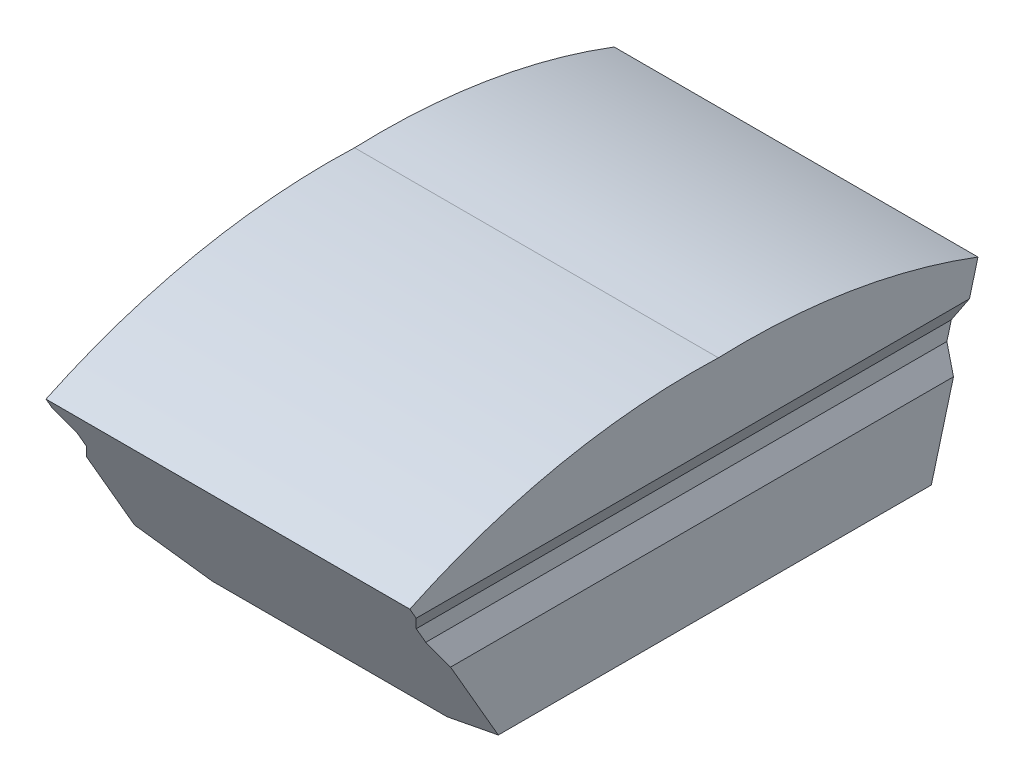
ISO-10303-21;
HEADER;
FILE_DESCRIPTION(('STEP AP214'),'2;1');
FILE_NAME('part.step','',(''),(''),'','','');
FILE_SCHEMA(('AUTOMOTIVE_DESIGN { 1 0 10303 214 1 1 1 1 }'));
ENDSEC;
DATA;
#1=APPLICATION_CONTEXT('core data for automotive mechanical design processes');
#2=APPLICATION_PROTOCOL_DEFINITION('international standard','automotive_design',2000,#1);
#3=PRODUCT_CONTEXT('',#1,'mechanical');
#4=PRODUCT('Part','Part','',(#3));
#5=PRODUCT_RELATED_PRODUCT_CATEGORY('part','',(#4));
#6=PRODUCT_DEFINITION_FORMATION('','',#4);
#7=PRODUCT_DEFINITION_CONTEXT('part definition',#1,'design');
#8=PRODUCT_DEFINITION('design','',#6,#7);
#9=PRODUCT_DEFINITION_SHAPE('','',#8);
#10=(LENGTH_UNIT() NAMED_UNIT(*) SI_UNIT(.MILLI.,.METRE.));
#11=(NAMED_UNIT(*) PLANE_ANGLE_UNIT() SI_UNIT($,.RADIAN.));
#12=(NAMED_UNIT(*) SI_UNIT($,.STERADIAN.) SOLID_ANGLE_UNIT());
#13=UNCERTAINTY_MEASURE_WITH_UNIT(LENGTH_MEASURE(1.E-05),#10,'distance_accuracy_value','');
#14=(GEOMETRIC_REPRESENTATION_CONTEXT(3) GLOBAL_UNCERTAINTY_ASSIGNED_CONTEXT((#13)) GLOBAL_UNIT_ASSIGNED_CONTEXT((#10,
#11,#12)) REPRESENTATION_CONTEXT('',''));
#15=CARTESIAN_POINT('',(0.,0.,0.));
#16=DIRECTION('',(0.,0.,1.));
#17=DIRECTION('',(1.,0.,0.));
#18=AXIS2_PLACEMENT_3D('',#15,#16,#17);
#19=CARTESIAN_POINT('',(0.,-31.2500000000001,-116.626587736527));
#20=DIRECTION('',(0.,0.258819045102521,0.965925826289068));
#21=DIRECTION('',(0.,-0.965925826289068,0.258819045102521));
#22=AXIS2_PLACEMENT_3D('',#19,#20,#21);
#23=PLANE('',#22);
#24=DIRECTION('',(0.937361302155128,0.336488672568508,-0.0901618680769524));
#25=VECTOR('',#24,1.);
#26=CARTESIAN_POINT('',(82.215832693011,4.0261963513373,-126.07881606091));
#27=LINE('',#26,#25);
#28=CARTESIAN_POINT('',(71.,0.,-125.));
#29=VERTEX_POINT('',#28);
#30=CARTESIAN_POINT('',(110.,14.,-128.751288694036));
#31=VERTEX_POINT('',#30);
#32=EDGE_CURVE('E197',#29,#31,#27,.T.);
#33=ORIENTED_EDGE('',*,*,#32,.F.);
#34=DIRECTION('',(1.,0.,0.));
#35=VECTOR('',#34,1.);
#36=CARTESIAN_POINT('',(71.,0.,-125.));
#37=LINE('',#36,#35);
#38=CARTESIAN_POINT('',(-71.,0.,-125.));
#39=VERTEX_POINT('',#38);
#40=EDGE_CURVE('E194',#39,#29,#37,.T.);
#41=ORIENTED_EDGE('',*,*,#40,.F.);
#42=DIRECTION('',(0.937361302155128,-0.336488672568508,0.0901618680769524));
#43=VECTOR('',#42,1.);
#44=CARTESIAN_POINT('',(-116.021531119151,16.1615752735415,-129.33048104296));
#45=LINE('',#44,#43);
#46=CARTESIAN_POINT('',(-110.,14.,-128.751288694036));
#47=VERTEX_POINT('',#46);
#48=EDGE_CURVE('E192',#47,#39,#45,.T.);
#49=ORIENTED_EDGE('',*,*,#48,.F.);
#50=DIRECTION('',(0.,-0.965925826289068,0.258819045102521));
#51=VECTOR('',#50,1.);
#52=CARTESIAN_POINT('',(-110.,31.8121778264911,-133.524047358084));
#53=LINE('',#52,#51);
#54=CARTESIAN_POINT('',(-110.,64.,-142.148748315592));
#55=VERTEX_POINT('',#54);
#56=EDGE_CURVE('E190',#55,#47,#53,.T.);
#57=ORIENTED_EDGE('',*,*,#56,.F.);
#58=DIRECTION('',(-0.485956523762208,-0.844202736364856,0.226203441457108));
#59=VECTOR('',#58,1.);
#60=CARTESIAN_POINT('',(-103.640698955989,75.0473655156623,-145.108880984005));
#61=LINE('',#60,#59);
#62=CARTESIAN_POINT('',(-102.516685226452,77.,-145.632087817196));
#63=VERTEX_POINT('',#62);
#64=EDGE_CURVE('E188',#63,#55,#61,.T.);
#65=ORIENTED_EDGE('',*,*,#64,.F.);
#66=DIRECTION('',(0.,-0.965925826289068,0.258819045102521));
#67=VECTOR('',#66,1.);
#68=CARTESIAN_POINT('',(-102.516685226452,90.5919780457009,-149.274047358084));
#69=LINE('',#68,#67);
#70=CARTESIAN_POINT('',(-102.516685226452,87.,-148.311579741508));
#71=VERTEX_POINT('',#70);
#72=EDGE_CURVE('E185',#71,#63,#69,.T.);
#73=ORIENTED_EDGE('',*,*,#72,.F.);
#74=DIRECTION('',(0.485956523762209,-0.844202736364856,0.226203441457108));
#75=VECTOR('',#74,1.);
#76=CARTESIAN_POINT('',(-115.298945337539,109.205317626289,-154.261476667148));
#77=LINE('',#76,#75);
#78=CARTESIAN_POINT('',(-110.,100.,-151.794919243112));
#79=VERTEX_POINT('',#78);
#80=EDGE_CURVE('E57',#79,#71,#77,.T.);
#81=ORIENTED_EDGE('',*,*,#80,.F.);
#82=DIRECTION('',(0.,-0.965925826289068,0.258819045102521));
#83=VECTOR('',#82,1.);
#84=CARTESIAN_POINT('',(-110.,158.701905283833,-167.524047358084));
#85=LINE('',#84,#83);
#86=CARTESIAN_POINT('',(-110.,119.294166686901,-156.964775625499));
#87=VERTEX_POINT('',#86);
#88=EDGE_CURVE('E198',#87,#79,#85,.T.);
#89=ORIENTED_EDGE('',*,*,#88,.F.);
#90=DIRECTION('',(-1.,0.,0.));
#91=VECTOR('',#90,1.);
#92=CARTESIAN_POINT('',(110.,119.294166686901,-156.964775625499));
#93=LINE('',#92,#91);
#94=CARTESIAN_POINT('',(110.,119.294166686901,-156.964775625499));
#95=VERTEX_POINT('',#94);
#96=EDGE_CURVE('E167',#95,#87,#93,.T.);
#97=ORIENTED_EDGE('',*,*,#96,.F.);
#98=DIRECTION('',(0.,0.965925826289068,-0.258819045102521));
#99=VECTOR('',#98,1.);
#100=CARTESIAN_POINT('',(110.,58.7019052838327,-140.729128114971));
#101=LINE('',#100,#99);
#102=CARTESIAN_POINT('',(110.,100.,-151.794919243112));
#103=VERTEX_POINT('',#102);
#104=EDGE_CURVE('E196',#103,#95,#101,.T.);
#105=ORIENTED_EDGE('',*,*,#104,.F.);
#106=DIRECTION('',(0.485956523762209,0.844202736364856,-0.226203441457108));
#107=VECTOR('',#106,1.);
#108=CARTESIAN_POINT('',(71.3289301081214,32.8206919249938,-133.794277896333));
#109=LINE('',#108,#107);
#110=CARTESIAN_POINT('',(102.516685226452,87.,-148.311579741508));
#111=VERTEX_POINT('',#110);
#112=EDGE_CURVE('E206',#111,#103,#109,.T.);
#113=ORIENTED_EDGE('',*,*,#112,.F.);
#114=DIRECTION('',(0.,0.965925826289068,-0.258819045102521));
#115=VECTOR('',#114,1.);
#116=CARTESIAN_POINT('',(102.516685226452,-9.40802195429931,-122.479128114971));
#117=LINE('',#116,#115);
#118=CARTESIAN_POINT('',(102.516685226452,77.,-145.632087817196));
#119=VERTEX_POINT('',#118);
#120=EDGE_CURVE('E208',#119,#111,#117,.T.);
#121=ORIENTED_EDGE('',*,*,#120,.F.);
#122=DIRECTION('',(-0.485956523762208,0.844202736364856,-0.226203441457108));
#123=VECTOR('',#122,1.);
#124=CARTESIAN_POINT('',(147.610714185407,-1.33726018563284,-124.641682213189));
#125=LINE('',#124,#123);
#126=CARTESIAN_POINT('',(110.,64.,-142.148748315592));
#127=VERTEX_POINT('',#126);
#128=EDGE_CURVE('E210',#127,#119,#125,.T.);
#129=ORIENTED_EDGE('',*,*,#128,.F.);
#130=DIRECTION('',(0.,0.965925826289068,-0.258819045102521));
#131=VECTOR('',#130,1.);
#132=CARTESIAN_POINT('',(110.,-68.1878221735091,-106.729128114971));
#133=LINE('',#132,#131);
#134=EDGE_CURVE('E204',#31,#127,#133,.T.);
#135=ORIENTED_EDGE('',*,*,#134,.F.);
#136=EDGE_LOOP('',(#33,#41,#49,#57,#65,#73,#81,#89,#97,#105,#113,#121,#129,#135));
#137=FACE_BOUND('',#136,.T.);
#138=ADVANCED_FACE('F41',(#137),#23,.F.);
#139=CARTESIAN_POINT('',(0.,-54.1265877365275,93.7499999999999));
#140=DIRECTION('',(0.,-0.500000000000001,0.866025403784438));
#141=DIRECTION('',(0.,-0.866025403784438,-0.500000000000001));
#142=AXIS2_PLACEMENT_3D('',#139,#140,#141);
#143=PLANE('',#142);
#144=DIRECTION('',(0.923783375421663,0.331614545023161,0.191457746836318));
#145=VECTOR('',#144,1.);
#146=CARTESIAN_POINT('',(121.835324587609,18.2485780570904,135.535821453589));
#147=LINE('',#146,#145);
#148=CARTESIAN_POINT('',(71.,0.,125.));
#149=VERTEX_POINT('',#148);
#150=CARTESIAN_POINT('',(110.,14.,133.082903768655));
#151=VERTEX_POINT('',#150);
#152=EDGE_CURVE('E228',#149,#151,#147,.T.);
#153=ORIENTED_EDGE('',*,*,#152,.T.);
#154=DIRECTION('',(0.,0.866025403784438,0.500000000000001));
#155=VECTOR('',#154,1.);
#156=CARTESIAN_POINT('',(110.,42.9759526419165,149.812177826491));
#157=LINE('',#156,#155);
#158=CARTESIAN_POINT('',(110.,64.,161.950417228136));
#159=VERTEX_POINT('',#158);
#160=EDGE_CURVE('E44',#151,#159,#157,.T.);
#161=ORIENTED_EDGE('',*,*,#160,.T.);
#162=DIRECTION('',(-0.446152589033643,0.775055417679234,0.447478454033985));
#163=VECTOR('',#162,1.);
#164=CARTESIAN_POINT('',(102.403641622863,77.1963791302553,169.569350271317));
#165=LINE('',#164,#163);
#166=CARTESIAN_POINT('',(102.516685226452,77.,169.455970727601));
#167=VERTEX_POINT('',#166);
#168=EDGE_CURVE('E240',#159,#167,#165,.T.);
#169=ORIENTED_EDGE('',*,*,#168,.T.);
#170=DIRECTION('',(0.,0.866025403784438,0.500000000000001));
#171=VECTOR('',#170,1.);
#172=CARTESIAN_POINT('',(102.516685226452,90.2259526419164,177.091978045701));
#173=LINE('',#172,#171);
#174=CARTESIAN_POINT('',(102.516685226452,87.,175.229473419498));
#175=VERTEX_POINT('',#174);
#176=EDGE_CURVE('E238',#167,#175,#173,.T.);
#177=ORIENTED_EDGE('',*,*,#176,.T.);
#178=DIRECTION('',(0.446152589033644,0.775055417679234,0.447478454033985));
#179=VECTOR('',#178,1.);
#180=CARTESIAN_POINT('',(113.446842602231,105.987848324568,186.192112761019));
#181=LINE('',#180,#179);
#182=CARTESIAN_POINT('',(110.,100.,182.735026918963));
#183=VERTEX_POINT('',#182);
#184=EDGE_CURVE('E224',#175,#183,#181,.T.);
#185=ORIENTED_EDGE('',*,*,#184,.T.);
#186=DIRECTION('',(0.,0.866025403784438,0.500000000000001));
#187=VECTOR('',#186,1.);
#188=CARTESIAN_POINT('',(110.,144.975952641916,208.701905283833));
#189=LINE('',#188,#187);
#190=CARTESIAN_POINT('',(110.,106.673784722498,186.58813832501));
#191=VERTEX_POINT('',#190);
#192=EDGE_CURVE('E229',#183,#191,#189,.T.);
#193=ORIENTED_EDGE('',*,*,#192,.T.);
#194=DIRECTION('',(-1.,0.,0.));
#195=VECTOR('',#194,1.);
#196=CARTESIAN_POINT('',(110.,106.673784722498,186.58813832501));
#197=LINE('',#196,#195);
#198=CARTESIAN_POINT('',(-110.,106.673784722498,186.58813832501));
#199=VERTEX_POINT('',#198);
#200=EDGE_CURVE('E201',#199,#191,#197,.F.);
#201=ORIENTED_EDGE('',*,*,#200,.F.);
#202=DIRECTION('',(0.,-0.866025403784438,-0.500000000000001));
#203=VECTOR('',#202,1.);
#204=CARTESIAN_POINT('',(-110.,-28.2291281149716,108.701905283833));
#205=LINE('',#204,#203);
#206=CARTESIAN_POINT('',(-110.,100.,182.735026918963));
#207=VERTEX_POINT('',#206);
#208=EDGE_CURVE('E155',#199,#207,#205,.T.);
#209=ORIENTED_EDGE('',*,*,#208,.T.);
#210=DIRECTION('',(0.446152589033644,-0.775055417679234,-0.447478454033985));
#211=VECTOR('',#210,1.);
#212=CARTESIAN_POINT('',(-33.5893742806173,-32.740391712939,106.097326031161));
#213=LINE('',#212,#211);
#214=CARTESIAN_POINT('',(-102.516685226452,87.,175.229473419498));
#215=VERTEX_POINT('',#214);
#216=EDGE_CURVE('E12',#207,#215,#213,.T.);
#217=ORIENTED_EDGE('',*,*,#216,.T.);
#218=DIRECTION('',(0.,-0.866025403784438,-0.500000000000001));
#219=VECTOR('',#218,1.);
#220=CARTESIAN_POINT('',(-102.516685226452,-82.9791281149716,77.0919780457006));
#221=LINE('',#220,#219);
#222=CARTESIAN_POINT('',(-102.516685226452,77.,169.455970727601));
#223=VERTEX_POINT('',#222);
#224=EDGE_CURVE('E49',#215,#223,#221,.T.);
#225=ORIENTED_EDGE('',*,*,#224,.T.);
#226=DIRECTION('',(-0.446152589033643,-0.775055417679234,-0.447478454033985));
#227=VECTOR('',#226,1.);
#228=CARTESIAN_POINT('',(-182.261109944477,-61.5318609072519,89.4745635414594));
#229=LINE('',#228,#227);
#230=CARTESIAN_POINT('',(-110.,64.,161.950417228136));
#231=VERTEX_POINT('',#230);
#232=EDGE_CURVE('E215',#223,#231,#229,.T.);
#233=ORIENTED_EDGE('',*,*,#232,.T.);
#234=DIRECTION('',(0.,-0.866025403784438,-0.500000000000001));
#235=VECTOR('',#234,1.);
#236=CARTESIAN_POINT('',(-110.,-130.229128114971,49.8121778264907));
#237=LINE('',#236,#235);
#238=CARTESIAN_POINT('',(-110.,14.,133.082903768655));
#239=VERTEX_POINT('',#238);
#240=EDGE_CURVE('E218',#231,#239,#237,.T.);
#241=ORIENTED_EDGE('',*,*,#240,.T.);
#242=DIRECTION('',(0.923783375421663,-0.331614545023161,-0.191457746836318));
#243=VECTOR('',#242,1.);
#244=CARTESIAN_POINT('',(-51.089131138377,-7.14749138622365,120.873393924133));
#245=LINE('',#244,#243);
#246=CARTESIAN_POINT('',(-71.,0.,125.));
#247=VERTEX_POINT('',#246);
#248=EDGE_CURVE('E221',#239,#247,#245,.T.);
#249=ORIENTED_EDGE('',*,*,#248,.T.);
#250=DIRECTION('',(1.,0.,0.));
#251=VECTOR('',#250,1.);
#252=CARTESIAN_POINT('',(71.,0.,125.));
#253=LINE('',#252,#251);
#254=EDGE_CURVE('E225',#247,#149,#253,.T.);
#255=ORIENTED_EDGE('',*,*,#254,.T.);
#256=EDGE_LOOP('',(#153,#161,#169,#177,#185,#193,#201,#209,#217,#225,#233,#241,#249,#255));
#257=FACE_BOUND('',#256,.T.);
#258=ADVANCED_FACE('F247',(#257),#143,.T.);
#259=CARTESIAN_POINT('',(110.,14.,200.));
#260=DIRECTION('',(-0.337864753606767,0.941194670761707,0.));
#261=DIRECTION('',(-0.941194670761707,-0.337864753606767,0.));
#262=AXIS2_PLACEMENT_3D('',#259,#260,#261);
#263=PLANE('',#262);
#264=ORIENTED_EDGE('',*,*,#152,.F.);
#265=DIRECTION('',(0.,0.,-1.));
#266=VECTOR('',#265,1.);
#267=CARTESIAN_POINT('',(71.,0.,200.));
#268=LINE('',#267,#266);
#269=EDGE_CURVE('E183',#149,#29,#268,.T.);
#270=ORIENTED_EDGE('',*,*,#269,.T.);
#271=ORIENTED_EDGE('',*,*,#32,.T.);
#272=DIRECTION('',(0.,0.,-1.));
#273=VECTOR('',#272,1.);
#274=CARTESIAN_POINT('',(110.,14.,200.));
#275=LINE('',#274,#273);
#276=EDGE_CURVE('E261',#151,#31,#275,.T.);
#277=ORIENTED_EDGE('',*,*,#276,.F.);
#278=EDGE_LOOP('',(#264,#270,#271,#277));
#279=FACE_BOUND('',#278,.T.);
#280=ADVANCED_FACE('F267',(#279),#263,.F.);
#281=CARTESIAN_POINT('',(110.,14.,200.));
#282=DIRECTION('',(-1.,0.,0.));
#283=DIRECTION('',(0.,-1.,0.));
#284=AXIS2_PLACEMENT_3D('',#281,#282,#283);
#285=PLANE('',#284);
#286=ORIENTED_EDGE('',*,*,#160,.F.);
#287=ORIENTED_EDGE('',*,*,#276,.T.);
#288=ORIENTED_EDGE('',*,*,#134,.T.);
#289=DIRECTION('',(0.,0.,-1.));
#290=VECTOR('',#289,1.);
#291=CARTESIAN_POINT('',(110.,64.,200.));
#292=LINE('',#291,#290);
#293=EDGE_CURVE('E254',#159,#127,#292,.T.);
#294=ORIENTED_EDGE('',*,*,#293,.F.);
#295=EDGE_LOOP('',(#286,#287,#288,#294));
#296=FACE_BOUND('',#295,.T.);
#297=ADVANCED_FACE('F310',(#296),#285,.F.);
#298=CARTESIAN_POINT('',(110.,64.,200.));
#299=DIRECTION('',(-0.866666666666666,-0.498887651569861,0.));
#300=DIRECTION('',(0.498887651569861,-0.866666666666666,0.));
#301=AXIS2_PLACEMENT_3D('',#298,#299,#300);
#302=PLANE('',#301);
#303=ORIENTED_EDGE('',*,*,#168,.F.);
#304=ORIENTED_EDGE('',*,*,#293,.T.);
#305=ORIENTED_EDGE('',*,*,#128,.T.);
#306=DIRECTION('',(0.,0.,-1.));
#307=VECTOR('',#306,1.);
#308=CARTESIAN_POINT('',(102.516685226452,77.,200.));
#309=LINE('',#308,#307);
#310=EDGE_CURVE('E256',#167,#119,#309,.T.);
#311=ORIENTED_EDGE('',*,*,#310,.F.);
#312=EDGE_LOOP('',(#303,#304,#305,#311));
#313=FACE_BOUND('',#312,.T.);
#314=ADVANCED_FACE('F253',(#313),#302,.F.);
#315=CARTESIAN_POINT('',(110.,-254.713869563195,15.1268793482812));
#316=DIRECTION('',(-1.,0.,0.));
#317=DIRECTION('',(0.,0.,1.));
#318=AXIS2_PLACEMENT_3D('',#315,#316,#317);
#319=CYLINDRICAL_SURFACE('',#318,400.);
#320=CARTESIAN_POINT('',(-110.,-254.713869563195,15.1268793482812));
#321=DIRECTION('',(-1.,0.,0.));
#322=DIRECTION('',(0.,0.,1.));
#323=AXIS2_PLACEMENT_3D('',#320,#321,#322);
#324=CIRCLE('',#323,400.);
#325=CARTESIAN_POINT('',(-110.,145.,0.));
#326=VERTEX_POINT('',#325);
#327=EDGE_CURVE('E150',#199,#326,#324,.T.);
#328=ORIENTED_EDGE('',*,*,#327,.F.);
#329=ORIENTED_EDGE('',*,*,#200,.T.);
#330=CARTESIAN_POINT('',(110.,-254.713869563195,15.1268793482812));
#331=DIRECTION('',(-1.,0.,0.));
#332=DIRECTION('',(0.,0.,1.));
#333=AXIS2_PLACEMENT_3D('',#330,#331,#332);
#334=CIRCLE('',#333,400.);
#335=CARTESIAN_POINT('',(110.,145.,0.));
#336=VERTEX_POINT('',#335);
#337=EDGE_CURVE('E172',#191,#336,#334,.T.);
#338=ORIENTED_EDGE('',*,*,#337,.T.);
#339=DIRECTION('',(-1.,0.,0.));
#340=VECTOR('',#339,1.);
#341=CARTESIAN_POINT('',(110.,145.,0.));
#342=LINE('',#341,#340);
#343=EDGE_CURVE('E165',#336,#326,#342,.T.);
#344=ORIENTED_EDGE('',*,*,#343,.T.);
#345=EDGE_LOOP('',(#328,#329,#338,#344));
#346=FACE_BOUND('',#345,.T.);
#347=ADVANCED_FACE('F171',(#346),#319,.T.);
#348=CARTESIAN_POINT('',(71.,0.,200.));
#349=DIRECTION('',(0.,1.,0.));
#350=DIRECTION('',(0.,0.,1.));
#351=AXIS2_PLACEMENT_3D('',#348,#349,#350);
#352=PLANE('',#351);
#353=ORIENTED_EDGE('',*,*,#254,.F.);
#354=DIRECTION('',(0.,0.,1.));
#355=VECTOR('',#354,1.);
#356=CARTESIAN_POINT('',(-71.,0.,-200.));
#357=LINE('',#356,#355);
#358=EDGE_CURVE('E280',#39,#247,#357,.T.);
#359=ORIENTED_EDGE('',*,*,#358,.F.);
#360=ORIENTED_EDGE('',*,*,#40,.T.);
#361=ORIENTED_EDGE('',*,*,#269,.F.);
#362=EDGE_LOOP('',(#353,#359,#360,#361));
#363=FACE_BOUND('',#362,.T.);
#364=ADVANCED_FACE('F271',(#363),#352,.F.);
#365=CARTESIAN_POINT('',(-110.,14.,-200.));
#366=DIRECTION('',(0.337864753606767,0.941194670761707,0.));
#367=DIRECTION('',(-0.941194670761707,0.337864753606767,0.));
#368=AXIS2_PLACEMENT_3D('',#365,#366,#367);
#369=PLANE('',#368);
#370=ORIENTED_EDGE('',*,*,#248,.F.);
#371=DIRECTION('',(0.,0.,1.));
#372=VECTOR('',#371,1.);
#373=CARTESIAN_POINT('',(-110.,14.,-200.));
#374=LINE('',#373,#372);
#375=EDGE_CURVE('E279',#47,#239,#374,.T.);
#376=ORIENTED_EDGE('',*,*,#375,.F.);
#377=ORIENTED_EDGE('',*,*,#48,.T.);
#378=ORIENTED_EDGE('',*,*,#358,.T.);
#379=EDGE_LOOP('',(#370,#376,#377,#378));
#380=FACE_BOUND('',#379,.T.);
#381=ADVANCED_FACE('F278',(#380),#369,.F.);
#382=CARTESIAN_POINT('',(-110.,14.,-200.));
#383=DIRECTION('',(1.,0.,0.));
#384=DIRECTION('',(0.,1.,0.));
#385=AXIS2_PLACEMENT_3D('',#382,#383,#384);
#386=PLANE('',#385);
#387=ORIENTED_EDGE('',*,*,#240,.F.);
#388=DIRECTION('',(0.,0.,1.));
#389=VECTOR('',#388,1.);
#390=CARTESIAN_POINT('',(-110.,64.,-200.));
#391=LINE('',#390,#389);
#392=EDGE_CURVE('E284',#55,#231,#391,.T.);
#393=ORIENTED_EDGE('',*,*,#392,.F.);
#394=ORIENTED_EDGE('',*,*,#56,.T.);
#395=ORIENTED_EDGE('',*,*,#375,.T.);
#396=EDGE_LOOP('',(#387,#393,#394,#395));
#397=FACE_BOUND('',#396,.T.);
#398=ADVANCED_FACE('F326',(#397),#386,.F.);
#399=CARTESIAN_POINT('',(-110.,64.,-200.));
#400=DIRECTION('',(0.866666666666666,-0.498887651569861,0.));
#401=DIRECTION('',(0.498887651569861,0.866666666666666,0.));
#402=AXIS2_PLACEMENT_3D('',#399,#400,#401);
#403=PLANE('',#402);
#404=ORIENTED_EDGE('',*,*,#232,.F.);
#405=DIRECTION('',(0.,0.,1.));
#406=VECTOR('',#405,1.);
#407=CARTESIAN_POINT('',(-102.516685226452,77.,-200.));
#408=LINE('',#407,#406);
#409=EDGE_CURVE('E288',#63,#223,#408,.T.);
#410=ORIENTED_EDGE('',*,*,#409,.F.);
#411=ORIENTED_EDGE('',*,*,#64,.T.);
#412=ORIENTED_EDGE('',*,*,#392,.T.);
#413=EDGE_LOOP('',(#404,#410,#411,#412));
#414=FACE_BOUND('',#413,.T.);
#415=ADVANCED_FACE('F350',(#414),#403,.F.);
#416=CARTESIAN_POINT('',(-102.516685226452,77.,-200.));
#417=DIRECTION('',(1.,0.,0.));
#418=DIRECTION('',(0.,0.,-1.));
#419=AXIS2_PLACEMENT_3D('',#416,#417,#418);
#420=PLANE('',#419);
#421=ORIENTED_EDGE('',*,*,#224,.F.);
#422=DIRECTION('',(0.,0.,1.));
#423=VECTOR('',#422,1.);
#424=CARTESIAN_POINT('',(-102.516685226452,87.,-200.));
#425=LINE('',#424,#423);
#426=EDGE_CURVE('E62',#71,#215,#425,.T.);
#427=ORIENTED_EDGE('',*,*,#426,.F.);
#428=ORIENTED_EDGE('',*,*,#72,.T.);
#429=ORIENTED_EDGE('',*,*,#409,.T.);
#430=EDGE_LOOP('',(#421,#427,#428,#429));
#431=FACE_BOUND('',#430,.T.);
#432=ADVANCED_FACE('F301',(#431),#420,.F.);
#433=CARTESIAN_POINT('',(-110.,150.,-200.));
#434=DIRECTION('',(1.,0.,0.));
#435=DIRECTION('',(0.,1.,0.));
#436=AXIS2_PLACEMENT_3D('',#433,#434,#435);
#437=PLANE('',#436);
#438=ORIENTED_EDGE('',*,*,#208,.F.);
#439=ORIENTED_EDGE('',*,*,#327,.T.);
#440=CARTESIAN_POINT('',(-110.,-254.713869563195,-15.1268793482812));
#441=DIRECTION('',(1.,0.,0.));
#442=DIRECTION('',(0.,0.,-1.));
#443=AXIS2_PLACEMENT_3D('',#440,#441,#442);
#444=CIRCLE('',#443,400.);
#445=EDGE_CURVE('E153',#87,#326,#444,.T.);
#446=ORIENTED_EDGE('',*,*,#445,.F.);
#447=ORIENTED_EDGE('',*,*,#88,.T.);
#448=DIRECTION('',(0.,0.,1.));
#449=VECTOR('',#448,1.);
#450=CARTESIAN_POINT('',(-110.,100.,-200.));
#451=LINE('',#450,#449);
#452=EDGE_CURVE('E169',#79,#207,#451,.T.);
#453=ORIENTED_EDGE('',*,*,#452,.T.);
#454=EDGE_LOOP('',(#438,#439,#446,#447,#453));
#455=FACE_BOUND('',#454,.T.);
#456=ADVANCED_FACE('F152',(#455),#437,.F.);
#457=CARTESIAN_POINT('',(-110.,100.,-200.));
#458=DIRECTION('',(0.866666666666665,0.498887651569861,0.));
#459=DIRECTION('',(-0.498887651569861,0.866666666666665,0.));
#460=AXIS2_PLACEMENT_3D('',#457,#458,#459);
#461=PLANE('',#460);
#462=ORIENTED_EDGE('',*,*,#216,.F.);
#463=ORIENTED_EDGE('',*,*,#452,.F.);
#464=ORIENTED_EDGE('',*,*,#80,.T.);
#465=ORIENTED_EDGE('',*,*,#426,.T.);
#466=EDGE_LOOP('',(#462,#463,#464,#465));
#467=FACE_BOUND('',#466,.T.);
#468=ADVANCED_FACE('F291',(#467),#461,.F.);
#469=CARTESIAN_POINT('',(110.,150.,200.));
#470=DIRECTION('',(-1.,0.,0.));
#471=DIRECTION('',(0.,-1.,0.));
#472=AXIS2_PLACEMENT_3D('',#469,#470,#471);
#473=PLANE('',#472);
#474=ORIENTED_EDGE('',*,*,#192,.F.);
#475=DIRECTION('',(0.,0.,-1.));
#476=VECTOR('',#475,1.);
#477=CARTESIAN_POINT('',(110.,100.,200.));
#478=LINE('',#477,#476);
#479=EDGE_CURVE('E174',#183,#103,#478,.T.);
#480=ORIENTED_EDGE('',*,*,#479,.T.);
#481=ORIENTED_EDGE('',*,*,#104,.T.);
#482=CARTESIAN_POINT('',(110.,-254.713869563195,-15.1268793482812));
#483=DIRECTION('',(1.,0.,0.));
#484=DIRECTION('',(0.,0.,-1.));
#485=AXIS2_PLACEMENT_3D('',#482,#483,#484);
#486=CIRCLE('',#485,400.);
#487=EDGE_CURVE('E179',#95,#336,#486,.T.);
#488=ORIENTED_EDGE('',*,*,#487,.T.);
#489=ORIENTED_EDGE('',*,*,#337,.F.);
#490=EDGE_LOOP('',(#474,#480,#481,#488,#489));
#491=FACE_BOUND('',#490,.T.);
#492=ADVANCED_FACE('F293',(#491),#473,.F.);
#493=CARTESIAN_POINT('',(110.,-254.713869563195,-15.1268793482812));
#494=DIRECTION('',(-1.,0.,0.));
#495=DIRECTION('',(0.,0.,1.));
#496=AXIS2_PLACEMENT_3D('',#493,#494,#495);
#497=CYLINDRICAL_SURFACE('',#496,400.);
#498=ORIENTED_EDGE('',*,*,#487,.F.);
#499=ORIENTED_EDGE('',*,*,#96,.T.);
#500=ORIENTED_EDGE('',*,*,#445,.T.);
#501=ORIENTED_EDGE('',*,*,#343,.F.);
#502=EDGE_LOOP('',(#498,#499,#500,#501));
#503=FACE_BOUND('',#502,.T.);
#504=ADVANCED_FACE('F164',(#503),#497,.T.);
#505=CARTESIAN_POINT('',(102.516685226452,77.,200.));
#506=DIRECTION('',(-1.,0.,0.));
#507=DIRECTION('',(0.,0.,1.));
#508=AXIS2_PLACEMENT_3D('',#505,#506,#507);
#509=PLANE('',#508);
#510=ORIENTED_EDGE('',*,*,#176,.F.);
#511=ORIENTED_EDGE('',*,*,#310,.T.);
#512=ORIENTED_EDGE('',*,*,#120,.T.);
#513=DIRECTION('',(0.,0.,-1.));
#514=VECTOR('',#513,1.);
#515=CARTESIAN_POINT('',(102.516685226452,87.,200.));
#516=LINE('',#515,#514);
#517=EDGE_CURVE('E177',#175,#111,#516,.T.);
#518=ORIENTED_EDGE('',*,*,#517,.F.);
#519=EDGE_LOOP('',(#510,#511,#512,#518));
#520=FACE_BOUND('',#519,.T.);
#521=ADVANCED_FACE('F334',(#520),#509,.F.);
#522=CARTESIAN_POINT('',(110.,100.,200.));
#523=DIRECTION('',(-0.866666666666665,0.498887651569861,0.));
#524=DIRECTION('',(-0.498887651569861,-0.866666666666665,0.));
#525=AXIS2_PLACEMENT_3D('',#522,#523,#524);
#526=PLANE('',#525);
#527=ORIENTED_EDGE('',*,*,#184,.F.);
#528=ORIENTED_EDGE('',*,*,#517,.T.);
#529=ORIENTED_EDGE('',*,*,#112,.T.);
#530=ORIENTED_EDGE('',*,*,#479,.F.);
#531=EDGE_LOOP('',(#527,#528,#529,#530));
#532=FACE_BOUND('',#531,.T.);
#533=ADVANCED_FACE('F309',(#532),#526,.F.);
#534=CLOSED_SHELL('',(#138,#258,#280,#297,#314,#347,#364,#381,#398,#415,#432,#456,#468,#492,
#504,#521,#533));
#535=MANIFOLD_SOLID_BREP('B2',#534);
#536=ADVANCED_BREP_SHAPE_REPRESENTATION('',(#18,#535),#14);
#537=SHAPE_DEFINITION_REPRESENTATION(#9,#536);
ENDSEC;
END-ISO-10303-21;
